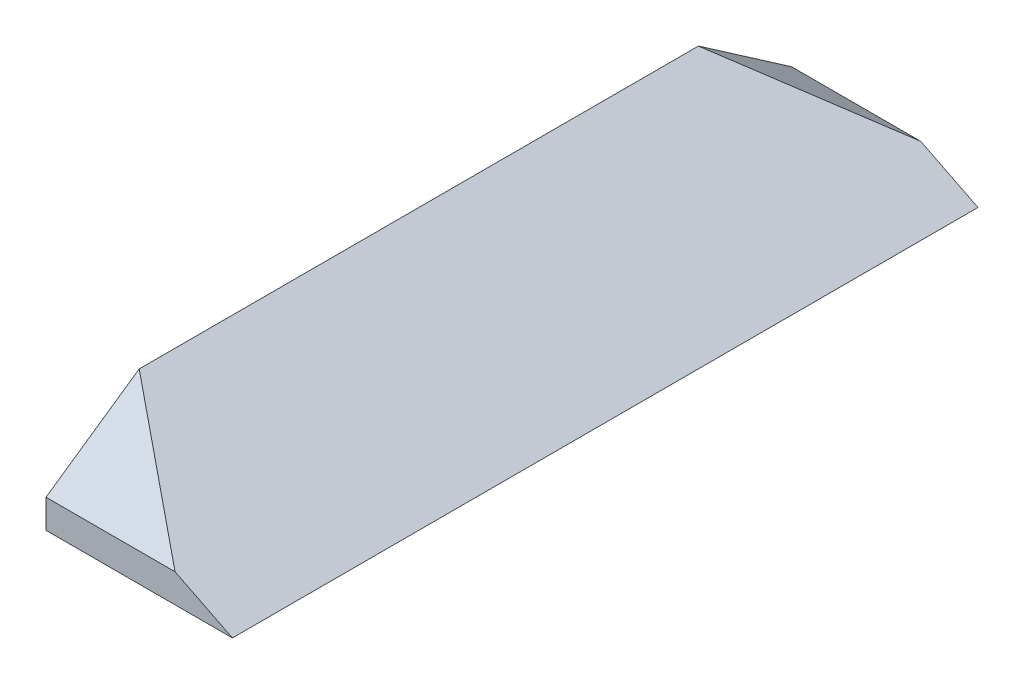
ISO-10303-21;
HEADER;
FILE_DESCRIPTION(('STEP AP214'),'2;1');
FILE_NAME('part.step','',(''),(''),'','','');
FILE_SCHEMA(('AUTOMOTIVE_DESIGN { 1 0 10303 214 1 1 1 1 }'));
ENDSEC;
DATA;
#1=APPLICATION_CONTEXT('core data for automotive mechanical design processes');
#2=APPLICATION_PROTOCOL_DEFINITION('international standard','automotive_design',2000,#1);
#3=PRODUCT_CONTEXT('',#1,'mechanical');
#4=PRODUCT('Part','Part','',(#3));
#5=PRODUCT_RELATED_PRODUCT_CATEGORY('part','',(#4));
#6=PRODUCT_DEFINITION_FORMATION('','',#4);
#7=PRODUCT_DEFINITION_CONTEXT('part definition',#1,'design');
#8=PRODUCT_DEFINITION('design','',#6,#7);
#9=PRODUCT_DEFINITION_SHAPE('','',#8);
#10=(LENGTH_UNIT() NAMED_UNIT(*) SI_UNIT(.MILLI.,.METRE.));
#11=(NAMED_UNIT(*) PLANE_ANGLE_UNIT() SI_UNIT($,.RADIAN.));
#12=(NAMED_UNIT(*) SI_UNIT($,.STERADIAN.) SOLID_ANGLE_UNIT());
#13=UNCERTAINTY_MEASURE_WITH_UNIT(LENGTH_MEASURE(1.E-05),#10,'distance_accuracy_value','');
#14=(GEOMETRIC_REPRESENTATION_CONTEXT(3) GLOBAL_UNCERTAINTY_ASSIGNED_CONTEXT((#13)) GLOBAL_UNIT_ASSIGNED_CONTEXT((#10,
#11,#12)) REPRESENTATION_CONTEXT('',''));
#15=CARTESIAN_POINT('',(0.,0.,0.));
#16=DIRECTION('',(0.,0.,1.));
#17=DIRECTION('',(1.,0.,0.));
#18=AXIS2_PLACEMENT_3D('',#15,#16,#17);
#19=CARTESIAN_POINT('',(0.,5.,40.));
#20=DIRECTION('',(1.,0.,0.));
#21=DIRECTION('',(0.,1.,0.));
#22=AXIS2_PLACEMENT_3D('',#19,#20,#21);
#23=PLANE('',#22);
#24=DIRECTION('',(0.,0.,-1.));
#25=VECTOR('',#24,1.);
#26=CARTESIAN_POINT('',(0.,5.,40.));
#27=LINE('',#26,#25);
#28=CARTESIAN_POINT('',(0.,5.,35.));
#29=VERTEX_POINT('',#28);
#30=CARTESIAN_POINT('',(0.,5.,5.));
#31=VERTEX_POINT('',#30);
#32=EDGE_CURVE('E89',#29,#31,#27,.T.);
#33=ORIENTED_EDGE('',*,*,#32,.T.);
#34=DIRECTION('',(0.,0.569303418686462,0.822127494657555));
#35=VECTOR('',#34,1.);
#36=CARTESIAN_POINT('',(0.,5.,5.));
#37=LINE('',#36,#35);
#38=CARTESIAN_POINT('',(0.,1.53762085329845,0.));
#39=VERTEX_POINT('',#38);
#40=EDGE_CURVE('E77',#39,#31,#37,.T.);
#41=ORIENTED_EDGE('',*,*,#40,.F.);
#42=DIRECTION('',(0.,-1.,0.));
#43=VECTOR('',#42,1.);
#44=CARTESIAN_POINT('',(0.,5.,0.));
#45=LINE('',#44,#43);
#46=CARTESIAN_POINT('',(0.,0.,0.));
#47=VERTEX_POINT('',#46);
#48=EDGE_CURVE('E86',#39,#47,#45,.T.);
#49=ORIENTED_EDGE('',*,*,#48,.T.);
#50=DIRECTION('',(0.,0.,-1.));
#51=VECTOR('',#50,1.);
#52=CARTESIAN_POINT('',(0.,0.,40.));
#53=LINE('',#52,#51);
#54=CARTESIAN_POINT('',(0.,0.,40.));
#55=VERTEX_POINT('',#54);
#56=EDGE_CURVE('E82',#55,#47,#53,.T.);
#57=ORIENTED_EDGE('',*,*,#56,.F.);
#58=DIRECTION('',(0.,-1.,0.));
#59=VECTOR('',#58,1.);
#60=CARTESIAN_POINT('',(0.,5.,40.));
#61=LINE('',#60,#59);
#62=CARTESIAN_POINT('',(0.,1.53762085329845,40.));
#63=VERTEX_POINT('',#62);
#64=EDGE_CURVE('E105',#63,#55,#61,.T.);
#65=ORIENTED_EDGE('',*,*,#64,.F.);
#66=DIRECTION('',(0.,-0.569303418686462,0.822127494657555));
#67=VECTOR('',#66,1.);
#68=CARTESIAN_POINT('',(0.,1.53762085329845,40.));
#69=LINE('',#68,#67);
#70=EDGE_CURVE('E46',#29,#63,#69,.T.);
#71=ORIENTED_EDGE('',*,*,#70,.F.);
#72=EDGE_LOOP('',(#33,#41,#49,#57,#65,#71));
#73=FACE_BOUND('',#72,.T.);
#74=ADVANCED_FACE('F33',(#73),#23,.F.);
#75=CARTESIAN_POINT('',(0.,0.,40.));
#76=DIRECTION('',(0.,1.,0.));
#77=DIRECTION('',(0.,0.,1.));
#78=AXIS2_PLACEMENT_3D('',#75,#76,#77);
#79=PLANE('',#78);
#80=DIRECTION('',(1.,0.,0.));
#81=VECTOR('',#80,1.);
#82=CARTESIAN_POINT('',(0.,0.,0.));
#83=LINE('',#82,#81);
#84=CARTESIAN_POINT('',(10.,0.,0.));
#85=VERTEX_POINT('',#84);
#86=EDGE_CURVE('E92',#47,#85,#83,.T.);
#87=ORIENTED_EDGE('',*,*,#86,.T.);
#88=DIRECTION('',(0.,0.,-1.));
#89=VECTOR('',#88,1.);
#90=CARTESIAN_POINT('',(10.,0.,40.));
#91=LINE('',#90,#89);
#92=CARTESIAN_POINT('',(10.,0.,40.));
#93=VERTEX_POINT('',#92);
#94=EDGE_CURVE('E107',#93,#85,#91,.T.);
#95=ORIENTED_EDGE('',*,*,#94,.F.);
#96=DIRECTION('',(1.,0.,0.));
#97=VECTOR('',#96,1.);
#98=CARTESIAN_POINT('',(0.,0.,40.));
#99=LINE('',#98,#97);
#100=EDGE_CURVE('E114',#55,#93,#99,.T.);
#101=ORIENTED_EDGE('',*,*,#100,.F.);
#102=ORIENTED_EDGE('',*,*,#56,.T.);
#103=EDGE_LOOP('',(#87,#95,#101,#102));
#104=FACE_BOUND('',#103,.T.);
#105=ADVANCED_FACE('F112',(#104),#79,.F.);
#106=CARTESIAN_POINT('',(10.,0.,40.));
#107=DIRECTION('',(-0.447213595499958,-0.894427190999916,0.));
#108=DIRECTION('',(0.894427190999916,-0.447213595499958,0.));
#109=AXIS2_PLACEMENT_3D('',#106,#107,#108);
#110=PLANE('',#109);
#111=DIRECTION('',(-0.894427190999916,0.447213595499958,0.));
#112=VECTOR('',#111,1.);
#113=CARTESIAN_POINT('',(10.,0.,0.));
#114=LINE('',#113,#112);
#115=CARTESIAN_POINT('',(6.92475829340311,1.53762085329845,0.));
#116=VERTEX_POINT('',#115);
#117=EDGE_CURVE('E96',#85,#116,#114,.T.);
#118=ORIENTED_EDGE('',*,*,#117,.T.);
#119=DIRECTION('',(-0.75135919263384,0.37567959631692,0.542516547725302));
#120=VECTOR('',#119,1.);
#121=CARTESIAN_POINT('',(-7.21010988068613,8.60505494034306,10.206037218335));
#122=LINE('',#121,#120);
#123=EDGE_CURVE('E54',#116,#31,#122,.T.);
#124=ORIENTED_EDGE('',*,*,#123,.T.);
#125=ORIENTED_EDGE('',*,*,#32,.F.);
#126=DIRECTION('',(0.75135919263384,-0.37567959631692,0.542516547725301));
#127=VECTOR('',#126,1.);
#128=CARTESIAN_POINT('',(9.09488193088911,0.452559034555445,41.5669309638962));
#129=LINE('',#128,#127);
#130=CARTESIAN_POINT('',(6.9247582934031,1.53762085329845,40.));
#131=VERTEX_POINT('',#130);
#132=EDGE_CURVE('E94',#29,#131,#129,.T.);
#133=ORIENTED_EDGE('',*,*,#132,.T.);
#134=DIRECTION('',(-0.894427190999916,0.447213595499958,0.));
#135=VECTOR('',#134,1.);
#136=CARTESIAN_POINT('',(10.,0.,40.));
#137=LINE('',#136,#135);
#138=EDGE_CURVE('E101',#93,#131,#137,.T.);
#139=ORIENTED_EDGE('',*,*,#138,.F.);
#140=ORIENTED_EDGE('',*,*,#94,.T.);
#141=EDGE_LOOP('',(#118,#124,#125,#133,#139,#140));
#142=FACE_BOUND('',#141,.T.);
#143=ADVANCED_FACE('F121',(#142),#110,.F.);
#144=CARTESIAN_POINT('',(0.,0.,40.));
#145=DIRECTION('',(0.,0.,1.));
#146=DIRECTION('',(1.,0.,0.));
#147=AXIS2_PLACEMENT_3D('',#144,#145,#146);
#148=PLANE('',#147);
#149=DIRECTION('',(1.,0.,0.));
#150=VECTOR('',#149,1.);
#151=CARTESIAN_POINT('',(0.,1.53762085329845,40.));
#152=LINE('',#151,#150);
#153=EDGE_CURVE('E11',#63,#131,#152,.T.);
#154=ORIENTED_EDGE('',*,*,#153,.F.);
#155=ORIENTED_EDGE('',*,*,#64,.T.);
#156=ORIENTED_EDGE('',*,*,#100,.T.);
#157=ORIENTED_EDGE('',*,*,#138,.T.);
#158=EDGE_LOOP('',(#154,#155,#156,#157));
#159=FACE_BOUND('',#158,.T.);
#160=ADVANCED_FACE('F124',(#159),#148,.T.);
#161=CARTESIAN_POINT('',(0.,0.,0.));
#162=DIRECTION('',(0.,0.,1.));
#163=DIRECTION('',(1.,0.,0.));
#164=AXIS2_PLACEMENT_3D('',#161,#162,#163);
#165=PLANE('',#164);
#166=ORIENTED_EDGE('',*,*,#48,.F.);
#167=DIRECTION('',(1.,0.,0.));
#168=VECTOR('',#167,1.);
#169=CARTESIAN_POINT('',(0.,1.53762085329845,0.));
#170=LINE('',#169,#168);
#171=EDGE_CURVE('E40',#39,#116,#170,.T.);
#172=ORIENTED_EDGE('',*,*,#171,.T.);
#173=ORIENTED_EDGE('',*,*,#117,.F.);
#174=ORIENTED_EDGE('',*,*,#86,.F.);
#175=EDGE_LOOP('',(#166,#172,#173,#174));
#176=FACE_BOUND('',#175,.T.);
#177=ADVANCED_FACE('F91',(#176),#165,.F.);
#178=CARTESIAN_POINT('',(30.,5.,5.));
#179=DIRECTION('',(0.,-0.822127494657555,0.569303418686462));
#180=DIRECTION('',(0.,-0.569303418686462,-0.822127494657555));
#181=AXIS2_PLACEMENT_3D('',#178,#179,#180);
#182=PLANE('',#181);
#183=ORIENTED_EDGE('',*,*,#171,.F.);
#184=ORIENTED_EDGE('',*,*,#40,.T.);
#185=ORIENTED_EDGE('',*,*,#123,.F.);
#186=EDGE_LOOP('',(#183,#184,#185));
#187=FACE_BOUND('',#186,.T.);
#188=ADVANCED_FACE('F76',(#187),#182,.F.);
#189=CARTESIAN_POINT('',(30.,1.53762085329845,40.));
#190=DIRECTION('',(0.,-0.822127494657554,-0.569303418686462));
#191=DIRECTION('',(0.,0.569303418686462,-0.822127494657555));
#192=AXIS2_PLACEMENT_3D('',#189,#190,#191);
#193=PLANE('',#192);
#194=ORIENTED_EDGE('',*,*,#70,.T.);
#195=ORIENTED_EDGE('',*,*,#153,.T.);
#196=ORIENTED_EDGE('',*,*,#132,.F.);
#197=EDGE_LOOP('',(#194,#195,#196));
#198=FACE_BOUND('',#197,.T.);
#199=ADVANCED_FACE('F125',(#198),#193,.F.);
#200=CLOSED_SHELL('',(#74,#105,#143,#160,#177,#188,#199));
#201=MANIFOLD_SOLID_BREP('B2',#200);
#202=ADVANCED_BREP_SHAPE_REPRESENTATION('',(#18,#201),#14);
#203=SHAPE_DEFINITION_REPRESENTATION(#9,#202);
ENDSEC;
END-ISO-10303-21;
